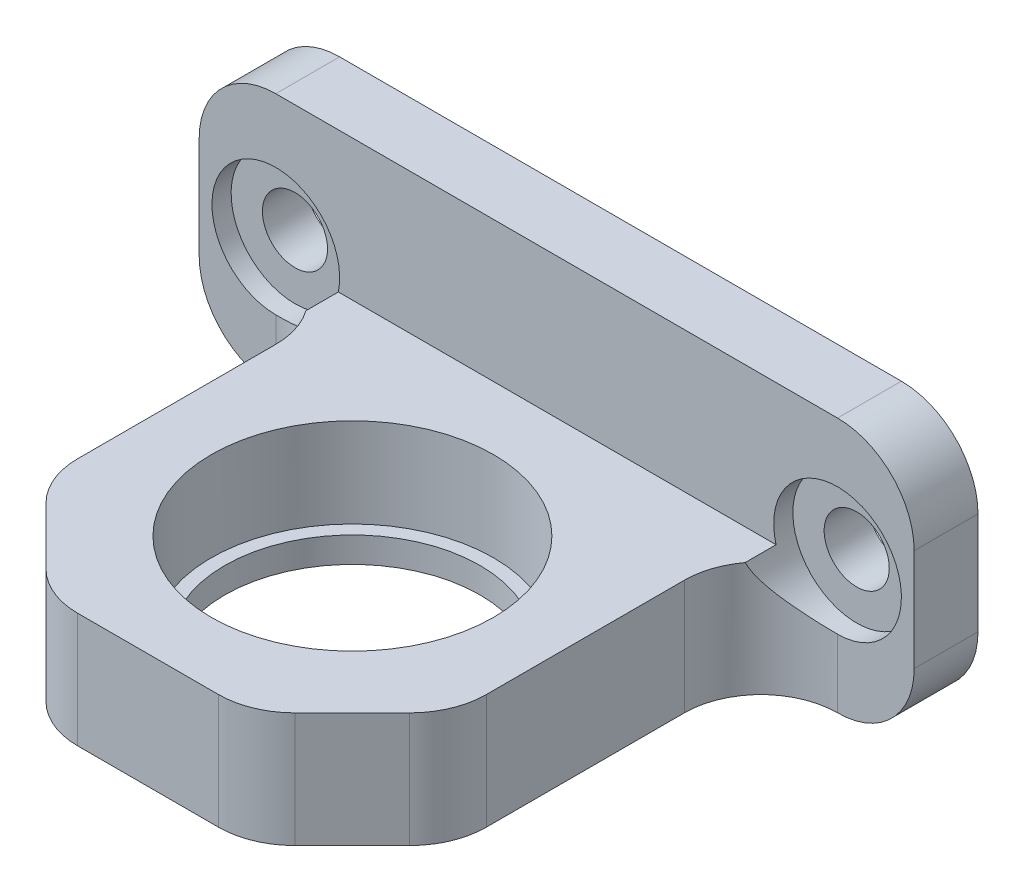
ISO-10303-21;
HEADER;
FILE_DESCRIPTION(('STEP AP214'),'2;1');
FILE_NAME('part.step','',(''),(''),'','','');
FILE_SCHEMA(('AUTOMOTIVE_DESIGN { 1 0 10303 214 1 1 1 1 }'));
ENDSEC;
DATA;
#1=APPLICATION_CONTEXT('core data for automotive mechanical design processes');
#2=APPLICATION_PROTOCOL_DEFINITION('international standard','automotive_design',2000,#1);
#3=PRODUCT_CONTEXT('',#1,'mechanical');
#4=PRODUCT('Part','Part','',(#3));
#5=PRODUCT_RELATED_PRODUCT_CATEGORY('part','',(#4));
#6=PRODUCT_DEFINITION_FORMATION('','',#4);
#7=PRODUCT_DEFINITION_CONTEXT('part definition',#1,'design');
#8=PRODUCT_DEFINITION('design','',#6,#7);
#9=PRODUCT_DEFINITION_SHAPE('','',#8);
#10=(LENGTH_UNIT() NAMED_UNIT(*) SI_UNIT(.MILLI.,.METRE.));
#11=(NAMED_UNIT(*) PLANE_ANGLE_UNIT() SI_UNIT($,.RADIAN.));
#12=(NAMED_UNIT(*) SI_UNIT($,.STERADIAN.) SOLID_ANGLE_UNIT());
#13=UNCERTAINTY_MEASURE_WITH_UNIT(LENGTH_MEASURE(1.E-05),#10,'distance_accuracy_value','');
#14=(GEOMETRIC_REPRESENTATION_CONTEXT(3) GLOBAL_UNCERTAINTY_ASSIGNED_CONTEXT((#13)) GLOBAL_UNIT_ASSIGNED_CONTEXT((#10,
#11,#12)) REPRESENTATION_CONTEXT('',''));
#15=CARTESIAN_POINT('',(0.,0.,0.));
#16=DIRECTION('',(0.,0.,1.));
#17=DIRECTION('',(1.,0.,0.));
#18=AXIS2_PLACEMENT_3D('',#15,#16,#17);
#19=CARTESIAN_POINT('',(22.,10.3404731594054,-21.));
#20=DIRECTION('',(0.,0.,1.));
#21=DIRECTION('',(1.,0.,0.));
#22=AXIS2_PLACEMENT_3D('',#19,#20,#21);
#23=CYLINDRICAL_SURFACE('',#22,2.55);
#24=CARTESIAN_POINT('',(22.,10.3404731594054,-21.));
#25=DIRECTION('',(0.,0.,1.));
#26=DIRECTION('',(1.,0.,0.));
#27=AXIS2_PLACEMENT_3D('',#24,#25,#26);
#28=CIRCLE('',#27,2.55);
#29=CARTESIAN_POINT('',(24.55,10.3404731594054,-21.));
#30=VERTEX_POINT('',#29);
#31=EDGE_CURVE('E446',#30,#30,#28,.T.);
#32=ORIENTED_EDGE('',*,*,#31,.F.);
#33=EDGE_LOOP('',(#32));
#34=FACE_BOUND('',#33,.T.);
#35=CARTESIAN_POINT('',(22.,10.3404731594054,-17.5));
#36=DIRECTION('',(0.,0.,1.));
#37=DIRECTION('',(1.,0.,0.));
#38=AXIS2_PLACEMENT_3D('',#35,#36,#37);
#39=CIRCLE('',#38,2.55);
#40=CARTESIAN_POINT('',(24.55,10.3404731594054,-17.5));
#41=VERTEX_POINT('',#40);
#42=EDGE_CURVE('E439',#41,#41,#39,.F.);
#43=ORIENTED_EDGE('',*,*,#42,.F.);
#44=EDGE_LOOP('',(#43));
#45=FACE_BOUND('',#44,.T.);
#46=ADVANCED_FACE('F33',(#34,#45),#23,.F.);
#47=CARTESIAN_POINT('',(-22.,10.,-21.));
#48=DIRECTION('',(0.,0.,1.));
#49=DIRECTION('',(1.,0.,0.));
#50=AXIS2_PLACEMENT_3D('',#47,#48,#49);
#51=CYLINDRICAL_SURFACE('',#50,2.55);
#52=CARTESIAN_POINT('',(-22.,10.,-21.));
#53=DIRECTION('',(0.,0.,1.));
#54=DIRECTION('',(1.,0.,0.));
#55=AXIS2_PLACEMENT_3D('',#52,#53,#54);
#56=CIRCLE('',#55,2.55);
#57=CARTESIAN_POINT('',(-19.45,10.,-21.));
#58=VERTEX_POINT('',#57);
#59=EDGE_CURVE('E451',#58,#58,#56,.T.);
#60=ORIENTED_EDGE('',*,*,#59,.F.);
#61=EDGE_LOOP('',(#60));
#62=FACE_BOUND('',#61,.T.);
#63=CARTESIAN_POINT('',(-22.,10.,-17.5));
#64=DIRECTION('',(0.,0.,1.));
#65=DIRECTION('',(1.,0.,0.));
#66=AXIS2_PLACEMENT_3D('',#63,#64,#65);
#67=CIRCLE('',#66,2.55);
#68=CARTESIAN_POINT('',(-19.45,10.,-17.5));
#69=VERTEX_POINT('',#68);
#70=EDGE_CURVE('E436',#69,#69,#67,.F.);
#71=ORIENTED_EDGE('',*,*,#70,.F.);
#72=EDGE_LOOP('',(#71));
#73=FACE_BOUND('',#72,.T.);
#74=ADVANCED_FACE('F304',(#62,#73),#51,.F.);
#75=CARTESIAN_POINT('',(0.,9.,0.));
#76=DIRECTION('',(0.,-1.,0.));
#77=DIRECTION('',(0.,0.,-1.));
#78=AXIS2_PLACEMENT_3D('',#75,#76,#77);
#79=PLANE('',#78);
#80=CARTESIAN_POINT('',(0.,9.,0.));
#81=DIRECTION('',(0.,1.,0.));
#82=DIRECTION('',(0.,0.,1.));
#83=AXIS2_PLACEMENT_3D('',#80,#81,#82);
#84=CIRCLE('',#83,11.05);
#85=CARTESIAN_POINT('',(0.,9.,11.05));
#86=VERTEX_POINT('',#85);
#87=EDGE_CURVE('E399',#86,#86,#84,.T.);
#88=ORIENTED_EDGE('',*,*,#87,.F.);
#89=EDGE_LOOP('',(#88));
#90=FACE_BOUND('',#89,.T.);
#91=DIRECTION('',(-0.707106781186549,0.,0.707106781186546));
#92=VECTOR('',#91,1.);
#93=CARTESIAN_POINT('',(16.,9.,8.));
#94=LINE('',#93,#92);
#95=CARTESIAN_POINT('',(9.75735931288069,9.,14.2426406871193));
#96=VERTEX_POINT('',#95);
#97=CARTESIAN_POINT('',(14.2426406871193,9.,9.75735931288072));
#98=VERTEX_POINT('',#97);
#99=EDGE_CURVE('E183',#96,#98,#94,.F.);
#100=ORIENTED_EDGE('',*,*,#99,.T.);
#101=CARTESIAN_POINT('',(10.,9.,5.51471862576143));
#102=DIRECTION('',(0.,-1.,0.));
#103=DIRECTION('',(0.,0.,-1.));
#104=AXIS2_PLACEMENT_3D('',#101,#102,#103);
#105=CIRCLE('',#104,6.);
#106=CARTESIAN_POINT('',(16.,9.,5.51471862576143));
#107=VERTEX_POINT('',#106);
#108=EDGE_CURVE('E178',#98,#107,#105,.F.);
#109=ORIENTED_EDGE('',*,*,#108,.T.);
#110=DIRECTION('',(0.,0.,-1.));
#111=VECTOR('',#110,1.);
#112=CARTESIAN_POINT('',(16.,9.,-16.));
#113=LINE('',#112,#111);
#114=CARTESIAN_POINT('',(16.,9.,-10.));
#115=VERTEX_POINT('',#114);
#116=EDGE_CURVE('E181',#107,#115,#113,.T.);
#117=ORIENTED_EDGE('',*,*,#116,.T.);
#118=CARTESIAN_POINT('',(22.,9.,-10.));
#119=DIRECTION('',(0.,-1.,0.));
#120=DIRECTION('',(0.,0.,-1.));
#121=AXIS2_PLACEMENT_3D('',#118,#119,#120);
#122=CIRCLE('',#121,6.);
#123=CARTESIAN_POINT('',(17.1830370866163,9.,-13.5772710675997));
#124=VERTEX_POINT('',#123);
#125=EDGE_CURVE('E55',#115,#124,#122,.T.);
#126=ORIENTED_EDGE('',*,*,#125,.T.);
#127=DIRECTION('',(0.,0.,-1.));
#128=VECTOR('',#127,1.);
#129=CARTESIAN_POINT('',(17.1830370866163,9.,-16.));
#130=LINE('',#129,#128);
#131=CARTESIAN_POINT('',(17.1830370866163,9.,-16.));
#132=VERTEX_POINT('',#131);
#133=EDGE_CURVE('E37',#132,#124,#130,.F.);
#134=ORIENTED_EDGE('',*,*,#133,.F.);
#135=DIRECTION('',(1.,0.,0.));
#136=VECTOR('',#135,1.);
#137=CARTESIAN_POINT('',(-28.,9.,-16.));
#138=LINE('',#137,#136);
#139=CARTESIAN_POINT('',(-17.1010205144336,9.,-16.));
#140=VERTEX_POINT('',#139);
#141=EDGE_CURVE('E207',#140,#132,#138,.T.);
#142=ORIENTED_EDGE('',*,*,#141,.F.);
#143=DIRECTION('',(0.,0.,-1.));
#144=VECTOR('',#143,1.);
#145=CARTESIAN_POINT('',(-17.1010205144336,9.,-13.4641016151377));
#146=LINE('',#145,#144);
#147=CARTESIAN_POINT('',(-17.1010205144336,9.,-13.4641016151377));
#148=VERTEX_POINT('',#147);
#149=EDGE_CURVE('E11',#140,#148,#146,.F.);
#150=ORIENTED_EDGE('',*,*,#149,.T.);
#151=CARTESIAN_POINT('',(-22.,9.,-9.99999999999999));
#152=DIRECTION('',(0.,-1.,0.));
#153=DIRECTION('',(0.,0.,-1.));
#154=AXIS2_PLACEMENT_3D('',#151,#152,#153);
#155=CIRCLE('',#154,6.);
#156=CARTESIAN_POINT('',(-16.,9.,-9.99999999999999));
#157=VERTEX_POINT('',#156);
#158=EDGE_CURVE('E289',#148,#157,#155,.T.);
#159=ORIENTED_EDGE('',*,*,#158,.T.);
#160=DIRECTION('',(0.,0.,1.));
#161=VECTOR('',#160,1.);
#162=CARTESIAN_POINT('',(-16.,9.,16.));
#163=LINE('',#162,#161);
#164=CARTESIAN_POINT('',(-16.,9.,5.51471862576141));
#165=VERTEX_POINT('',#164);
#166=EDGE_CURVE('E413',#157,#165,#163,.T.);
#167=ORIENTED_EDGE('',*,*,#166,.T.);
#168=CARTESIAN_POINT('',(-10.,9.,5.51471862576141));
#169=DIRECTION('',(0.,-1.,0.));
#170=DIRECTION('',(0.,0.,-1.));
#171=AXIS2_PLACEMENT_3D('',#168,#169,#170);
#172=CIRCLE('',#171,6.);
#173=CARTESIAN_POINT('',(-14.2426406871193,9.,9.75735931288069));
#174=VERTEX_POINT('',#173);
#175=EDGE_CURVE('E224',#165,#174,#172,.F.);
#176=ORIENTED_EDGE('',*,*,#175,.T.);
#177=DIRECTION('',(-0.707106781186546,0.,-0.707106781186549));
#178=VECTOR('',#177,1.);
#179=CARTESIAN_POINT('',(-8.,9.,16.));
#180=LINE('',#179,#178);
#181=CARTESIAN_POINT('',(-9.75735931288071,9.,14.2426406871193));
#182=VERTEX_POINT('',#181);
#183=EDGE_CURVE('E429',#174,#182,#180,.F.);
#184=ORIENTED_EDGE('',*,*,#183,.T.);
#185=CARTESIAN_POINT('',(-5.51471862576142,9.,10.));
#186=DIRECTION('',(0.,-1.,0.));
#187=DIRECTION('',(0.,0.,-1.));
#188=AXIS2_PLACEMENT_3D('',#185,#186,#187);
#189=CIRCLE('',#188,6.);
#190=CARTESIAN_POINT('',(-5.51471862576142,9.,16.));
#191=VERTEX_POINT('',#190);
#192=EDGE_CURVE('E226',#182,#191,#189,.F.);
#193=ORIENTED_EDGE('',*,*,#192,.T.);
#194=DIRECTION('',(1.,0.,0.));
#195=VECTOR('',#194,1.);
#196=CARTESIAN_POINT('',(16.,9.,16.));
#197=LINE('',#196,#195);
#198=CARTESIAN_POINT('',(5.51471862576142,9.,16.));
#199=VERTEX_POINT('',#198);
#200=EDGE_CURVE('E199',#191,#199,#197,.T.);
#201=ORIENTED_EDGE('',*,*,#200,.T.);
#202=CARTESIAN_POINT('',(5.51471862576142,9.,10.));
#203=DIRECTION('',(0.,-1.,0.));
#204=DIRECTION('',(0.,0.,-1.));
#205=AXIS2_PLACEMENT_3D('',#202,#203,#204);
#206=CIRCLE('',#205,6.);
#207=EDGE_CURVE('E188',#199,#96,#206,.F.);
#208=ORIENTED_EDGE('',*,*,#207,.T.);
#209=EDGE_LOOP('',(#100,#109,#117,#126,#134,#142,#150,#159,#167,#176,#184,#193,#201,#208));
#210=FACE_BOUND('',#209,.T.);
#211=ADVANCED_FACE('F180',(#90,#210),#79,.F.);
#212=CARTESIAN_POINT('',(0.,9.,0.));
#213=DIRECTION('',(0.,-1.,0.));
#214=DIRECTION('',(0.,0.,-1.));
#215=AXIS2_PLACEMENT_3D('',#212,#213,#214);
#216=CYLINDRICAL_SURFACE('',#215,11.05);
#217=ORIENTED_EDGE('',*,*,#87,.T.);
#218=EDGE_LOOP('',(#217));
#219=FACE_BOUND('',#218,.T.);
#220=CARTESIAN_POINT('',(0.,2.,0.));
#221=DIRECTION('',(0.,-1.,0.));
#222=DIRECTION('',(0.,0.,-1.));
#223=AXIS2_PLACEMENT_3D('',#220,#221,#222);
#224=CIRCLE('',#223,11.05);
#225=CARTESIAN_POINT('',(0.,2.,-11.05));
#226=VERTEX_POINT('',#225);
#227=EDGE_CURVE('E405',#226,#226,#224,.T.);
#228=ORIENTED_EDGE('',*,*,#227,.T.);
#229=EDGE_LOOP('',(#228));
#230=FACE_BOUND('',#229,.T.);
#231=ADVANCED_FACE('F323',(#219,#230),#216,.F.);
#232=CARTESIAN_POINT('',(0.,0.,0.));
#233=DIRECTION('',(0.,-1.,0.));
#234=DIRECTION('',(0.,0.,-1.));
#235=AXIS2_PLACEMENT_3D('',#232,#233,#234);
#236=PLANE('',#235);
#237=DIRECTION('',(0.,0.,-1.));
#238=VECTOR('',#237,1.);
#239=CARTESIAN_POINT('',(16.,0.,-16.));
#240=LINE('',#239,#238);
#241=CARTESIAN_POINT('',(16.,0.,5.51471862576143));
#242=VERTEX_POINT('',#241);
#243=CARTESIAN_POINT('',(16.,0.,-10.));
#244=VERTEX_POINT('',#243);
#245=EDGE_CURVE('E402',#242,#244,#240,.T.);
#246=ORIENTED_EDGE('',*,*,#245,.F.);
#247=CARTESIAN_POINT('',(10.,0.,5.51471862576143));
#248=DIRECTION('',(0.,-1.,0.));
#249=DIRECTION('',(0.,0.,-1.));
#250=AXIS2_PLACEMENT_3D('',#247,#248,#249);
#251=CIRCLE('',#250,6.);
#252=CARTESIAN_POINT('',(14.2426406871193,0.,9.75735931288072));
#253=VERTEX_POINT('',#252);
#254=EDGE_CURVE('E202',#242,#253,#251,.T.);
#255=ORIENTED_EDGE('',*,*,#254,.T.);
#256=DIRECTION('',(0.707106781186549,0.,-0.707106781186546));
#257=VECTOR('',#256,1.);
#258=CARTESIAN_POINT('',(12.,0.,12.));
#259=LINE('',#258,#257);
#260=CARTESIAN_POINT('',(9.7573593128807,0.,14.2426406871193));
#261=VERTEX_POINT('',#260);
#262=EDGE_CURVE('E426',#253,#261,#259,.F.);
#263=ORIENTED_EDGE('',*,*,#262,.T.);
#264=CARTESIAN_POINT('',(5.51471862576142,0.,10.));
#265=DIRECTION('',(0.,-1.,0.));
#266=DIRECTION('',(0.,0.,-1.));
#267=AXIS2_PLACEMENT_3D('',#264,#265,#266);
#268=CIRCLE('',#267,6.);
#269=CARTESIAN_POINT('',(5.51471862576142,0.,16.));
#270=VERTEX_POINT('',#269);
#271=EDGE_CURVE('E217',#261,#270,#268,.T.);
#272=ORIENTED_EDGE('',*,*,#271,.T.);
#273=DIRECTION('',(1.,0.,0.));
#274=VECTOR('',#273,1.);
#275=CARTESIAN_POINT('',(16.,0.,16.));
#276=LINE('',#275,#274);
#277=CARTESIAN_POINT('',(-5.51471862576142,0.,16.));
#278=VERTEX_POINT('',#277);
#279=EDGE_CURVE('E398',#278,#270,#276,.T.);
#280=ORIENTED_EDGE('',*,*,#279,.F.);
#281=CARTESIAN_POINT('',(-5.51471862576142,0.,10.));
#282=DIRECTION('',(0.,-1.,0.));
#283=DIRECTION('',(0.,0.,-1.));
#284=AXIS2_PLACEMENT_3D('',#281,#282,#283);
#285=CIRCLE('',#284,6.);
#286=CARTESIAN_POINT('',(-9.75735931288071,0.,14.2426406871193));
#287=VERTEX_POINT('',#286);
#288=EDGE_CURVE('E215',#278,#287,#285,.T.);
#289=ORIENTED_EDGE('',*,*,#288,.T.);
#290=DIRECTION('',(0.707106781186546,0.,0.707106781186549));
#291=VECTOR('',#290,1.);
#292=CARTESIAN_POINT('',(-12.,0.,12.));
#293=LINE('',#292,#291);
#294=CARTESIAN_POINT('',(-14.2426406871193,0.,9.75735931288069));
#295=VERTEX_POINT('',#294);
#296=EDGE_CURVE('E394',#287,#295,#293,.F.);
#297=ORIENTED_EDGE('',*,*,#296,.T.);
#298=CARTESIAN_POINT('',(-10.,0.,5.51471862576141));
#299=DIRECTION('',(0.,-1.,0.));
#300=DIRECTION('',(0.,0.,-1.));
#301=AXIS2_PLACEMENT_3D('',#298,#299,#300);
#302=CIRCLE('',#301,6.);
#303=CARTESIAN_POINT('',(-16.,0.,5.51471862576141));
#304=VERTEX_POINT('',#303);
#305=EDGE_CURVE('E213',#295,#304,#302,.T.);
#306=ORIENTED_EDGE('',*,*,#305,.T.);
#307=DIRECTION('',(0.,0.,1.));
#308=VECTOR('',#307,1.);
#309=CARTESIAN_POINT('',(-16.,0.,16.));
#310=LINE('',#309,#308);
#311=CARTESIAN_POINT('',(-16.,0.,-9.99999999999999));
#312=VERTEX_POINT('',#311);
#313=EDGE_CURVE('E392',#312,#304,#310,.T.);
#314=ORIENTED_EDGE('',*,*,#313,.F.);
#315=CARTESIAN_POINT('',(-22.,0.,-9.99999999999999));
#316=DIRECTION('',(0.,-1.,0.));
#317=DIRECTION('',(0.,0.,-1.));
#318=AXIS2_PLACEMENT_3D('',#315,#316,#317);
#319=CIRCLE('',#318,6.);
#320=CARTESIAN_POINT('',(-22.,0.,-16.));
#321=VERTEX_POINT('',#320);
#322=EDGE_CURVE('E281',#312,#321,#319,.F.);
#323=ORIENTED_EDGE('',*,*,#322,.T.);
#324=DIRECTION('',(0.,0.,1.));
#325=VECTOR('',#324,1.);
#326=CARTESIAN_POINT('',(-22.,0.,-21.));
#327=LINE('',#326,#325);
#328=CARTESIAN_POINT('',(-22.,0.,-21.));
#329=VERTEX_POINT('',#328);
#330=EDGE_CURVE('E203',#321,#329,#327,.F.);
#331=ORIENTED_EDGE('',*,*,#330,.T.);
#332=DIRECTION('',(-1.,0.,0.));
#333=VECTOR('',#332,1.);
#334=CARTESIAN_POINT('',(-28.,0.,-21.));
#335=LINE('',#334,#333);
#336=CARTESIAN_POINT('',(22.,0.,-21.));
#337=VERTEX_POINT('',#336);
#338=EDGE_CURVE('E410',#337,#329,#335,.T.);
#339=ORIENTED_EDGE('',*,*,#338,.F.);
#340=DIRECTION('',(0.,0.,-1.));
#341=VECTOR('',#340,1.);
#342=CARTESIAN_POINT('',(22.,0.,-16.));
#343=LINE('',#342,#341);
#344=CARTESIAN_POINT('',(22.,0.,-16.));
#345=VERTEX_POINT('',#344);
#346=EDGE_CURVE('E205',#337,#345,#343,.F.);
#347=ORIENTED_EDGE('',*,*,#346,.T.);
#348=CARTESIAN_POINT('',(22.,0.,-10.));
#349=DIRECTION('',(0.,-1.,0.));
#350=DIRECTION('',(0.,0.,-1.));
#351=AXIS2_PLACEMENT_3D('',#348,#349,#350);
#352=CIRCLE('',#351,6.);
#353=EDGE_CURVE('E513',#345,#244,#352,.F.);
#354=ORIENTED_EDGE('',*,*,#353,.T.);
#355=EDGE_LOOP('',(#246,#255,#263,#272,#280,#289,#297,#306,#314,#323,#331,#339,#347,#354));
#356=FACE_BOUND('',#355,.T.);
#357=CARTESIAN_POINT('',(0.,0.,0.));
#358=DIRECTION('',(0.,-1.,0.));
#359=DIRECTION('',(0.,0.,-1.));
#360=AXIS2_PLACEMENT_3D('',#357,#358,#359);
#361=CIRCLE('',#360,10.);
#362=CARTESIAN_POINT('',(0.,0.,-10.));
#363=VERTEX_POINT('',#362);
#364=EDGE_CURVE('E463',#363,#363,#361,.T.);
#365=ORIENTED_EDGE('',*,*,#364,.F.);
#366=EDGE_LOOP('',(#365));
#367=FACE_BOUND('',#366,.T.);
#368=ADVANCED_FACE('F326',(#356,#367),#236,.T.);
#369=CARTESIAN_POINT('',(-28.,9.,-16.));
#370=DIRECTION('',(1.,0.,0.));
#371=DIRECTION('',(0.,0.,-1.));
#372=AXIS2_PLACEMENT_3D('',#369,#370,#371);
#373=PLANE('',#372);
#374=DIRECTION('',(0.,-1.,0.));
#375=VECTOR('',#374,1.);
#376=CARTESIAN_POINT('',(-28.,9.,-16.));
#377=LINE('',#376,#375);
#378=CARTESIAN_POINT('',(-28.,14.,-16.));
#379=VERTEX_POINT('',#378);
#380=CARTESIAN_POINT('',(-28.,6.,-16.));
#381=VERTEX_POINT('',#380);
#382=EDGE_CURVE('E422',#379,#381,#377,.T.);
#383=ORIENTED_EDGE('',*,*,#382,.F.);
#384=DIRECTION('',(0.,0.,1.));
#385=VECTOR('',#384,1.);
#386=CARTESIAN_POINT('',(-28.,14.,-21.));
#387=LINE('',#386,#385);
#388=CARTESIAN_POINT('',(-28.,14.,-21.));
#389=VERTEX_POINT('',#388);
#390=EDGE_CURVE('E279',#379,#389,#387,.F.);
#391=ORIENTED_EDGE('',*,*,#390,.T.);
#392=DIRECTION('',(0.,-1.,0.));
#393=VECTOR('',#392,1.);
#394=CARTESIAN_POINT('',(-28.,9.,-21.));
#395=LINE('',#394,#393);
#396=CARTESIAN_POINT('',(-28.,6.,-21.));
#397=VERTEX_POINT('',#396);
#398=EDGE_CURVE('E198',#389,#397,#395,.T.);
#399=ORIENTED_EDGE('',*,*,#398,.T.);
#400=DIRECTION('',(0.,0.,1.));
#401=VECTOR('',#400,1.);
#402=CARTESIAN_POINT('',(-28.,6.,-16.));
#403=LINE('',#402,#401);
#404=EDGE_CURVE('E276',#397,#381,#403,.T.);
#405=ORIENTED_EDGE('',*,*,#404,.T.);
#406=EDGE_LOOP('',(#383,#391,#399,#405));
#407=FACE_BOUND('',#406,.T.);
#408=ADVANCED_FACE('F333',(#407),#373,.F.);
#409=CARTESIAN_POINT('',(-16.,9.,16.));
#410=DIRECTION('',(1.,0.,0.));
#411=DIRECTION('',(0.,0.,-1.));
#412=AXIS2_PLACEMENT_3D('',#409,#410,#411);
#413=PLANE('',#412);
#414=ORIENTED_EDGE('',*,*,#313,.T.);
#415=DIRECTION('',(0.,-1.,0.));
#416=VECTOR('',#415,1.);
#417=CARTESIAN_POINT('',(-16.,9.,5.51471862576141));
#418=LINE('',#417,#416);
#419=EDGE_CURVE('E241',#304,#165,#418,.F.);
#420=ORIENTED_EDGE('',*,*,#419,.T.);
#421=ORIENTED_EDGE('',*,*,#166,.F.);
#422=DIRECTION('',(0.,-1.,0.));
#423=VECTOR('',#422,1.);
#424=CARTESIAN_POINT('',(-16.,0.,-9.99999999999999));
#425=LINE('',#424,#423);
#426=EDGE_CURVE('E238',#157,#312,#425,.T.);
#427=ORIENTED_EDGE('',*,*,#426,.T.);
#428=EDGE_LOOP('',(#414,#420,#421,#427));
#429=FACE_BOUND('',#428,.T.);
#430=ADVANCED_FACE('F353',(#429),#413,.F.);
#431=CARTESIAN_POINT('',(16.,9.,16.));
#432=DIRECTION('',(0.,0.,-1.));
#433=DIRECTION('',(-1.,0.,0.));
#434=AXIS2_PLACEMENT_3D('',#431,#432,#433);
#435=PLANE('',#434);
#436=ORIENTED_EDGE('',*,*,#279,.T.);
#437=DIRECTION('',(0.,-1.,0.));
#438=VECTOR('',#437,1.);
#439=CARTESIAN_POINT('',(5.51471862576142,9.,16.));
#440=LINE('',#439,#438);
#441=EDGE_CURVE('E231',#270,#199,#440,.F.);
#442=ORIENTED_EDGE('',*,*,#441,.T.);
#443=ORIENTED_EDGE('',*,*,#200,.F.);
#444=DIRECTION('',(0.,1.,0.));
#445=VECTOR('',#444,1.);
#446=CARTESIAN_POINT('',(-5.51471862576142,0.,16.));
#447=LINE('',#446,#445);
#448=EDGE_CURVE('E187',#191,#278,#447,.F.);
#449=ORIENTED_EDGE('',*,*,#448,.T.);
#450=EDGE_LOOP('',(#436,#442,#443,#449));
#451=FACE_BOUND('',#450,.T.);
#452=ADVANCED_FACE('F350',(#451),#435,.F.);
#453=CARTESIAN_POINT('',(16.,9.,-16.));
#454=DIRECTION('',(-1.,0.,0.));
#455=DIRECTION('',(0.,0.,1.));
#456=AXIS2_PLACEMENT_3D('',#453,#454,#455);
#457=PLANE('',#456);
#458=ORIENTED_EDGE('',*,*,#116,.F.);
#459=DIRECTION('',(0.,1.,0.));
#460=VECTOR('',#459,1.);
#461=CARTESIAN_POINT('',(16.,0.,5.51471862576143));
#462=LINE('',#461,#460);
#463=EDGE_CURVE('E194',#107,#242,#462,.F.);
#464=ORIENTED_EDGE('',*,*,#463,.T.);
#465=ORIENTED_EDGE('',*,*,#245,.T.);
#466=DIRECTION('',(0.,-1.,0.));
#467=VECTOR('',#466,1.);
#468=CARTESIAN_POINT('',(16.,9.,-10.));
#469=LINE('',#468,#467);
#470=EDGE_CURVE('E197',#244,#115,#469,.F.);
#471=ORIENTED_EDGE('',*,*,#470,.T.);
#472=EDGE_LOOP('',(#458,#464,#465,#471));
#473=FACE_BOUND('',#472,.T.);
#474=ADVANCED_FACE('F192',(#473),#457,.F.);
#475=CARTESIAN_POINT('',(28.,9.,-16.));
#476=DIRECTION('',(0.,0.,-1.));
#477=DIRECTION('',(-1.,0.,0.));
#478=AXIS2_PLACEMENT_3D('',#475,#476,#477);
#479=PLANE('',#478);
#480=CARTESIAN_POINT('',(-22.,10.,-16.));
#481=DIRECTION('',(0.,0.,-1.));
#482=DIRECTION('',(-1.,0.,0.));
#483=AXIS2_PLACEMENT_3D('',#480,#481,#482);
#484=CIRCLE('',#483,5.);
#485=CARTESIAN_POINT('',(-22.,5.,-16.));
#486=VERTEX_POINT('',#485);
#487=EDGE_CURVE('E443',#140,#486,#484,.F.);
#488=ORIENTED_EDGE('',*,*,#487,.F.);
#489=ORIENTED_EDGE('',*,*,#141,.T.);
#490=CARTESIAN_POINT('',(22.,10.3404731594054,-16.));
#491=DIRECTION('',(0.,0.,-1.));
#492=DIRECTION('',(-1.,0.,0.));
#493=AXIS2_PLACEMENT_3D('',#490,#491,#492);
#494=CIRCLE('',#493,5.);
#495=CARTESIAN_POINT('',(22.,5.34047315940536,-16.));
#496=VERTEX_POINT('',#495);
#497=EDGE_CURVE('E444',#496,#132,#494,.F.);
#498=ORIENTED_EDGE('',*,*,#497,.F.);
#499=DIRECTION('',(0.,-1.,0.));
#500=VECTOR('',#499,1.);
#501=CARTESIAN_POINT('',(22.,0.,-16.));
#502=LINE('',#501,#500);
#503=EDGE_CURVE('E255',#496,#345,#502,.T.);
#504=ORIENTED_EDGE('',*,*,#503,.T.);
#505=CARTESIAN_POINT('',(22.,6.,-16.));
#506=DIRECTION('',(0.,0.,-1.));
#507=DIRECTION('',(-1.,0.,0.));
#508=AXIS2_PLACEMENT_3D('',#505,#506,#507);
#509=CIRCLE('',#508,6.);
#510=CARTESIAN_POINT('',(28.,6.,-16.));
#511=VERTEX_POINT('',#510);
#512=EDGE_CURVE('E253',#345,#511,#509,.F.);
#513=ORIENTED_EDGE('',*,*,#512,.T.);
#514=DIRECTION('',(0.,-1.,0.));
#515=VECTOR('',#514,1.);
#516=CARTESIAN_POINT('',(28.,9.,-16.));
#517=LINE('',#516,#515);
#518=CARTESIAN_POINT('',(28.,14.,-16.));
#519=VERTEX_POINT('',#518);
#520=EDGE_CURVE('E419',#519,#511,#517,.T.);
#521=ORIENTED_EDGE('',*,*,#520,.F.);
#522=CARTESIAN_POINT('',(22.,14.,-16.));
#523=DIRECTION('',(0.,0.,-1.));
#524=DIRECTION('',(-1.,0.,0.));
#525=AXIS2_PLACEMENT_3D('',#522,#523,#524);
#526=CIRCLE('',#525,6.);
#527=CARTESIAN_POINT('',(22.,20.,-16.));
#528=VERTEX_POINT('',#527);
#529=EDGE_CURVE('E251',#519,#528,#526,.F.);
#530=ORIENTED_EDGE('',*,*,#529,.T.);
#531=DIRECTION('',(-1.,0.,0.));
#532=VECTOR('',#531,1.);
#533=CARTESIAN_POINT('',(-28.,20.,-16.));
#534=LINE('',#533,#532);
#535=CARTESIAN_POINT('',(-22.,20.,-16.));
#536=VERTEX_POINT('',#535);
#537=EDGE_CURVE('E456',#528,#536,#534,.T.);
#538=ORIENTED_EDGE('',*,*,#537,.T.);
#539=CARTESIAN_POINT('',(-22.,14.,-16.));
#540=DIRECTION('',(0.,0.,-1.));
#541=DIRECTION('',(-1.,0.,0.));
#542=AXIS2_PLACEMENT_3D('',#539,#540,#541);
#543=CIRCLE('',#542,6.);
#544=EDGE_CURVE('E249',#536,#379,#543,.F.);
#545=ORIENTED_EDGE('',*,*,#544,.T.);
#546=ORIENTED_EDGE('',*,*,#382,.T.);
#547=CARTESIAN_POINT('',(-22.,6.,-16.));
#548=DIRECTION('',(0.,0.,-1.));
#549=DIRECTION('',(-1.,0.,0.));
#550=AXIS2_PLACEMENT_3D('',#547,#548,#549);
#551=CIRCLE('',#550,6.);
#552=EDGE_CURVE('E244',#381,#321,#551,.F.);
#553=ORIENTED_EDGE('',*,*,#552,.T.);
#554=DIRECTION('',(0.,-1.,0.));
#555=VECTOR('',#554,1.);
#556=CARTESIAN_POINT('',(-22.,9.,-16.));
#557=LINE('',#556,#555);
#558=EDGE_CURVE('E247',#321,#486,#557,.F.);
#559=ORIENTED_EDGE('',*,*,#558,.T.);
#560=EDGE_LOOP('',(#488,#489,#498,#504,#513,#521,#530,#538,#545,#546,#553,#559));
#561=FACE_BOUND('',#560,.T.);
#562=ADVANCED_FACE('F343',(#561),#479,.F.);
#563=CARTESIAN_POINT('',(28.,9.,-21.));
#564=DIRECTION('',(-1.,0.,0.));
#565=DIRECTION('',(0.,0.,1.));
#566=AXIS2_PLACEMENT_3D('',#563,#564,#565);
#567=PLANE('',#566);
#568=ORIENTED_EDGE('',*,*,#520,.T.);
#569=DIRECTION('',(0.,0.,-1.));
#570=VECTOR('',#569,1.);
#571=CARTESIAN_POINT('',(28.,6.,-21.));
#572=LINE('',#571,#570);
#573=CARTESIAN_POINT('',(28.,6.,-21.));
#574=VERTEX_POINT('',#573);
#575=EDGE_CURVE('E260',#511,#574,#572,.T.);
#576=ORIENTED_EDGE('',*,*,#575,.T.);
#577=DIRECTION('',(0.,-1.,0.));
#578=VECTOR('',#577,1.);
#579=CARTESIAN_POINT('',(28.,9.,-21.));
#580=LINE('',#579,#578);
#581=CARTESIAN_POINT('',(28.,14.,-21.));
#582=VERTEX_POINT('',#581);
#583=EDGE_CURVE('E416',#582,#574,#580,.T.);
#584=ORIENTED_EDGE('',*,*,#583,.F.);
#585=DIRECTION('',(0.,0.,1.));
#586=VECTOR('',#585,1.);
#587=CARTESIAN_POINT('',(28.,14.,-16.));
#588=LINE('',#587,#586);
#589=EDGE_CURVE('E257',#582,#519,#588,.T.);
#590=ORIENTED_EDGE('',*,*,#589,.T.);
#591=EDGE_LOOP('',(#568,#576,#584,#590));
#592=FACE_BOUND('',#591,.T.);
#593=ADVANCED_FACE('F339',(#592),#567,.F.);
#594=CARTESIAN_POINT('',(-28.,9.,-21.));
#595=DIRECTION('',(0.,0.,1.));
#596=DIRECTION('',(1.,0.,0.));
#597=AXIS2_PLACEMENT_3D('',#594,#595,#596);
#598=PLANE('',#597);
#599=ORIENTED_EDGE('',*,*,#59,.T.);
#600=EDGE_LOOP('',(#599));
#601=FACE_BOUND('',#600,.T.);
#602=ORIENTED_EDGE('',*,*,#31,.T.);
#603=EDGE_LOOP('',(#602));
#604=FACE_BOUND('',#603,.T.);
#605=ORIENTED_EDGE('',*,*,#583,.T.);
#606=CARTESIAN_POINT('',(22.,6.,-21.));
#607=DIRECTION('',(0.,0.,1.));
#608=DIRECTION('',(1.,0.,0.));
#609=AXIS2_PLACEMENT_3D('',#606,#607,#608);
#610=CIRCLE('',#609,6.);
#611=EDGE_CURVE('E269',#574,#337,#610,.F.);
#612=ORIENTED_EDGE('',*,*,#611,.T.);
#613=ORIENTED_EDGE('',*,*,#338,.T.);
#614=CARTESIAN_POINT('',(-22.,6.,-21.));
#615=DIRECTION('',(0.,0.,1.));
#616=DIRECTION('',(1.,0.,0.));
#617=AXIS2_PLACEMENT_3D('',#614,#615,#616);
#618=CIRCLE('',#617,6.);
#619=EDGE_CURVE('E263',#329,#397,#618,.F.);
#620=ORIENTED_EDGE('',*,*,#619,.T.);
#621=ORIENTED_EDGE('',*,*,#398,.F.);
#622=CARTESIAN_POINT('',(-22.,14.,-21.));
#623=DIRECTION('',(0.,0.,1.));
#624=DIRECTION('',(1.,0.,0.));
#625=AXIS2_PLACEMENT_3D('',#622,#623,#624);
#626=CIRCLE('',#625,6.);
#627=CARTESIAN_POINT('',(-22.,20.,-21.));
#628=VERTEX_POINT('',#627);
#629=EDGE_CURVE('E265',#389,#628,#626,.F.);
#630=ORIENTED_EDGE('',*,*,#629,.T.);
#631=DIRECTION('',(1.,0.,0.));
#632=VECTOR('',#631,1.);
#633=CARTESIAN_POINT('',(-28.,20.,-21.));
#634=LINE('',#633,#632);
#635=CARTESIAN_POINT('',(22.,20.,-21.));
#636=VERTEX_POINT('',#635);
#637=EDGE_CURVE('E460',#628,#636,#634,.T.);
#638=ORIENTED_EDGE('',*,*,#637,.T.);
#639=CARTESIAN_POINT('',(22.,14.,-21.));
#640=DIRECTION('',(0.,0.,1.));
#641=DIRECTION('',(1.,0.,0.));
#642=AXIS2_PLACEMENT_3D('',#639,#640,#641);
#643=CIRCLE('',#642,6.);
#644=EDGE_CURVE('E267',#636,#582,#643,.F.);
#645=ORIENTED_EDGE('',*,*,#644,.T.);
#646=EDGE_LOOP('',(#605,#612,#613,#620,#621,#630,#638,#645));
#647=FACE_BOUND('',#646,.T.);
#648=ADVANCED_FACE('F335',(#601,#604,#647),#598,.F.);
#649=CARTESIAN_POINT('',(16.,9.,8.));
#650=DIRECTION('',(-0.707106781186546,0.,-0.707106781186548));
#651=DIRECTION('',(0.,-1.,0.));
#652=AXIS2_PLACEMENT_3D('',#649,#650,#651);
#653=PLANE('',#652);
#654=ORIENTED_EDGE('',*,*,#262,.F.);
#655=DIRECTION('',(0.,-1.,0.));
#656=VECTOR('',#655,1.);
#657=CARTESIAN_POINT('',(14.2426406871193,9.,9.75735931288072));
#658=LINE('',#657,#656);
#659=EDGE_CURVE('E222',#253,#98,#658,.F.);
#660=ORIENTED_EDGE('',*,*,#659,.T.);
#661=ORIENTED_EDGE('',*,*,#99,.F.);
#662=DIRECTION('',(0.,1.,0.));
#663=VECTOR('',#662,1.);
#664=CARTESIAN_POINT('',(9.75735931288069,0.,14.2426406871193));
#665=LINE('',#664,#663);
#666=EDGE_CURVE('E220',#96,#261,#665,.F.);
#667=ORIENTED_EDGE('',*,*,#666,.T.);
#668=EDGE_LOOP('',(#654,#660,#661,#667));
#669=FACE_BOUND('',#668,.T.);
#670=ADVANCED_FACE('F338',(#669),#653,.F.);
#671=CARTESIAN_POINT('',(-8.,9.,16.));
#672=DIRECTION('',(0.707106781186549,0.,-0.707106781186546));
#673=DIRECTION('',(0.,-1.,0.));
#674=AXIS2_PLACEMENT_3D('',#671,#672,#673);
#675=PLANE('',#674);
#676=ORIENTED_EDGE('',*,*,#296,.F.);
#677=DIRECTION('',(0.,-1.,0.));
#678=VECTOR('',#677,1.);
#679=CARTESIAN_POINT('',(-9.75735931288071,9.,14.2426406871193));
#680=LINE('',#679,#678);
#681=EDGE_CURVE('E236',#287,#182,#680,.F.);
#682=ORIENTED_EDGE('',*,*,#681,.T.);
#683=ORIENTED_EDGE('',*,*,#183,.F.);
#684=DIRECTION('',(0.,1.,0.));
#685=VECTOR('',#684,1.);
#686=CARTESIAN_POINT('',(-14.2426406871193,0.,9.75735931288069));
#687=LINE('',#686,#685);
#688=EDGE_CURVE('E234',#174,#295,#687,.F.);
#689=ORIENTED_EDGE('',*,*,#688,.T.);
#690=EDGE_LOOP('',(#676,#682,#683,#689));
#691=FACE_BOUND('',#690,.T.);
#692=ADVANCED_FACE('F321',(#691),#675,.F.);
#693=CARTESIAN_POINT('',(0.,2.,0.));
#694=DIRECTION('',(0.,-1.,0.));
#695=DIRECTION('',(0.,0.,-1.));
#696=AXIS2_PLACEMENT_3D('',#693,#694,#695);
#697=PLANE('',#696);
#698=CARTESIAN_POINT('',(0.,2.,0.));
#699=DIRECTION('',(0.,-1.,0.));
#700=DIRECTION('',(0.,0.,-1.));
#701=AXIS2_PLACEMENT_3D('',#698,#699,#700);
#702=CIRCLE('',#701,10.);
#703=CARTESIAN_POINT('',(0.,2.,-10.));
#704=VERTEX_POINT('',#703);
#705=EDGE_CURVE('E435',#704,#704,#702,.T.);
#706=ORIENTED_EDGE('',*,*,#705,.T.);
#707=EDGE_LOOP('',(#706));
#708=FACE_BOUND('',#707,.T.);
#709=ORIENTED_EDGE('',*,*,#227,.F.);
#710=EDGE_LOOP('',(#709));
#711=FACE_BOUND('',#710,.T.);
#712=ADVANCED_FACE('F317',(#708,#711),#697,.F.);
#713=CARTESIAN_POINT('',(0.,2.,0.));
#714=DIRECTION('',(0.,-1.,0.));
#715=DIRECTION('',(0.,0.,-1.));
#716=AXIS2_PLACEMENT_3D('',#713,#714,#715);
#717=CYLINDRICAL_SURFACE('',#716,10.);
#718=ORIENTED_EDGE('',*,*,#705,.F.);
#719=EDGE_LOOP('',(#718));
#720=FACE_BOUND('',#719,.T.);
#721=ORIENTED_EDGE('',*,*,#364,.T.);
#722=EDGE_LOOP('',(#721));
#723=FACE_BOUND('',#722,.T.);
#724=ADVANCED_FACE('F313',(#720,#723),#717,.F.);
#725=CARTESIAN_POINT('',(-28.,20.,-78.0701322935211));
#726=DIRECTION('',(0.,1.,0.));
#727=DIRECTION('',(0.,0.,1.));
#728=AXIS2_PLACEMENT_3D('',#725,#726,#727);
#729=PLANE('',#728);
#730=ORIENTED_EDGE('',*,*,#537,.F.);
#731=DIRECTION('',(0.,0.,1.));
#732=VECTOR('',#731,1.);
#733=CARTESIAN_POINT('',(22.,20.,-21.));
#734=LINE('',#733,#732);
#735=EDGE_CURVE('E274',#528,#636,#734,.F.);
#736=ORIENTED_EDGE('',*,*,#735,.T.);
#737=ORIENTED_EDGE('',*,*,#637,.F.);
#738=DIRECTION('',(0.,0.,1.));
#739=VECTOR('',#738,1.);
#740=CARTESIAN_POINT('',(-22.,20.,-16.));
#741=LINE('',#740,#739);
#742=EDGE_CURVE('E271',#628,#536,#741,.T.);
#743=ORIENTED_EDGE('',*,*,#742,.T.);
#744=EDGE_LOOP('',(#730,#736,#737,#743));
#745=FACE_BOUND('',#744,.T.);
#746=ADVANCED_FACE('F301',(#745),#729,.T.);
#747=CARTESIAN_POINT('',(-22.,10.,-6.));
#748=DIRECTION('',(0.,0.,-1.));
#749=DIRECTION('',(-1.,0.,0.));
#750=AXIS2_PLACEMENT_3D('',#747,#748,#749);
#751=CYLINDRICAL_SURFACE('',#750,5.);
#752=CARTESIAN_POINT('',(-22.,10.,-17.5));
#753=DIRECTION('',(0.,0.,1.));
#754=DIRECTION('',(1.,0.,0.));
#755=AXIS2_PLACEMENT_3D('',#752,#753,#754);
#756=CIRCLE('',#755,5.);
#757=CARTESIAN_POINT('',(-17.,10.,-17.5));
#758=VERTEX_POINT('',#757);
#759=EDGE_CURVE('E729',#758,#758,#756,.T.);
#760=ORIENTED_EDGE('',*,*,#759,.F.);
#761=EDGE_LOOP('',(#760));
#762=FACE_BOUND('',#761,.T.);
#763=ORIENTED_EDGE('',*,*,#487,.T.);
#764=CARTESIAN_POINT('',(-22.,5.,-16.));
#765=CARTESIAN_POINT('',(-21.8806648207195,4.99997202847822,-16.000029183418));
#766=CARTESIAN_POINT('',(-21.7613479343884,5.00427098058813,-15.9964410262926));
#767=CARTESIAN_POINT('',(-21.5238201363629,5.02131096987406,-15.9822490295306));
#768=CARTESIAN_POINT('',(-21.4056085061772,5.03404607051304,-15.9716501233819));
#769=CARTESIAN_POINT('',(-21.1720645381227,5.06762141944364,-15.9437594959527));
#770=CARTESIAN_POINT('',(-21.0567172985143,5.08840048802287,-15.9265182983554));
#771=CARTESIAN_POINT('',(-20.8288244206442,5.13770232719081,-15.8857239180364));
#772=CARTESIAN_POINT('',(-20.7162791417845,5.16622608564603,-15.8621699300977));
#773=CARTESIAN_POINT('',(-20.4950156511032,5.23048680134044,-15.8092962749121));
#774=CARTESIAN_POINT('',(-20.3862877576041,5.26620368734832,-15.7799926567871));
#775=CARTESIAN_POINT('',(-20.1728799032746,5.34440480803738,-15.7161228971515));
#776=CARTESIAN_POINT('',(-20.0682014293066,5.3868914996821,-15.6815548452237));
#777=CARTESIAN_POINT('',(-19.7606711610699,5.52387069151109,-15.5707113290423));
#778=CARTESIAN_POINT('',(-19.5644626306319,5.62784133927979,-15.4873305892445));
#779=CARTESIAN_POINT('',(-19.2512946634051,5.82064767574377,-15.3352306081538));
#780=CARTESIAN_POINT('',(-19.1289070399765,5.90385916725544,-15.2702230161879));
#781=CARTESIAN_POINT('',(-18.8937041616226,6.07923225448275,-15.1351036558362));
#782=CARTESIAN_POINT('',(-18.7808890961821,6.17139402728806,-15.0649917864643));
#783=CARTESIAN_POINT('',(-18.5645823422536,6.36420713404151,-14.9208607028787));
#784=CARTESIAN_POINT('',(-18.4611268613701,6.46488874572616,-14.8468279357524));
#785=CARTESIAN_POINT('',(-18.2640199828492,6.67387874383037,-14.6965735314705));
#786=CARTESIAN_POINT('',(-18.1703674746073,6.78218626396017,-14.6203521435191));
#787=CARTESIAN_POINT('',(-17.9910639299656,7.00839742529323,-14.4657277504505));
#788=CARTESIAN_POINT('',(-17.9056131493249,7.12645089669107,-14.3873118095147));
#789=CARTESIAN_POINT('',(-17.7449686850084,7.37016684309937,-14.2316913984726));
#790=CARTESIAN_POINT('',(-17.6697779980127,7.49583152571933,-14.1544872881091));
#791=CARTESIAN_POINT('',(-17.5304264441487,7.75405276037758,-14.0041644871796));
#792=CARTESIAN_POINT('',(-17.4661915085789,7.88655443922633,-13.9310208179248));
#793=CARTESIAN_POINT('',(-17.3486877755119,8.15951619706664,-13.7912558827877));
#794=CARTESIAN_POINT('',(-17.2954113244464,8.29997063370269,-13.7246300819005));
#795=CARTESIAN_POINT('',(-17.1964134115726,8.60248514328405,-13.59620669379));
#796=CARTESIAN_POINT('',(-17.1518045455888,8.76535180454495,-13.5353844014582));
#797=CARTESIAN_POINT('',(-17.0783099665741,9.10172995105932,-13.4323511227873));
#798=CARTESIAN_POINT('',(-17.0495641482094,9.27532158951348,-13.3903063327462));
#799=CARTESIAN_POINT('',(-17.0300022101679,9.45307955874389,-13.361416661032));
#800=B_SPLINE_CURVE_WITH_KNOTS('',3,(#764,#765,#766,#767,#768,#769,#770,#771,#772,#773,#774,
#775,#776,#777,#778,#779,#780,#781,#782,#783,#784,#785,#786,#787,#788,#789,#790,#791,#792,#793,
#794,#795,#796,#797,#798,#799),.UNSPECIFIED.,.F.,.F.,(4,2,2,2,2,2,2,2,2,2,2,2,2,2,2,2,2,4),(0.,
0.357845344312491,0.715439139161972,1.07036500055284,1.42533615545792,1.77933021380853,
2.13345304097954,2.84213806663911,3.32653214070429,3.81093580091177,4.29713970109727,
4.78328845821013,5.27927441347619,5.77540492340351,6.26803544217961,6.76032072340998,
7.29694347482022,7.83822595793125),.UNSPECIFIED.);
#801=EDGE_CURVE('E48',#486,#148,#800,.T.);
#802=ORIENTED_EDGE('',*,*,#801,.T.);
#803=ORIENTED_EDGE('',*,*,#149,.F.);
#804=EDGE_LOOP('',(#763,#802,#803));
#805=FACE_BOUND('',#804,.T.);
#806=ADVANCED_FACE('F295',(#762,#805),#751,.F.);
#807=CARTESIAN_POINT('',(-22.,10.,-17.5));
#808=DIRECTION('',(0.,0.,1.));
#809=DIRECTION('',(1.,0.,0.));
#810=AXIS2_PLACEMENT_3D('',#807,#808,#809);
#811=PLANE('',#810);
#812=ORIENTED_EDGE('',*,*,#759,.T.);
#813=EDGE_LOOP('',(#812));
#814=FACE_BOUND('',#813,.T.);
#815=ORIENTED_EDGE('',*,*,#70,.T.);
#816=EDGE_LOOP('',(#815));
#817=FACE_BOUND('',#816,.T.);
#818=ADVANCED_FACE('F300',(#814,#817),#811,.T.);
#819=CARTESIAN_POINT('',(22.,10.3404731594054,-6.));
#820=DIRECTION('',(0.,0.,-1.));
#821=DIRECTION('',(-1.,0.,0.));
#822=AXIS2_PLACEMENT_3D('',#819,#820,#821);
#823=CYLINDRICAL_SURFACE('',#822,5.);
#824=CARTESIAN_POINT('',(22.,10.3404731594054,-17.5));
#825=DIRECTION('',(0.,0.,1.));
#826=DIRECTION('',(1.,0.,0.));
#827=AXIS2_PLACEMENT_3D('',#824,#825,#826);
#828=CIRCLE('',#827,5.);
#829=CARTESIAN_POINT('',(27.,10.3404731594054,-17.5));
#830=VERTEX_POINT('',#829);
#831=EDGE_CURVE('E440',#830,#830,#828,.T.);
#832=ORIENTED_EDGE('',*,*,#831,.F.);
#833=EDGE_LOOP('',(#832));
#834=FACE_BOUND('',#833,.T.);
#835=ORIENTED_EDGE('',*,*,#497,.T.);
#836=ORIENTED_EDGE('',*,*,#133,.T.);
#837=CARTESIAN_POINT('',(22.,5.34047315940536,-16.));
#838=CARTESIAN_POINT('',(21.8806648207195,5.34044518788359,-16.000029183418));
#839=CARTESIAN_POINT('',(21.7613479343884,5.3447441399935,-15.9964410262926));
#840=CARTESIAN_POINT('',(21.5238201363629,5.36178412927942,-15.9822490295306));
#841=CARTESIAN_POINT('',(21.4056085061772,5.3745192299184,-15.9716501233819));
#842=CARTESIAN_POINT('',(21.1720645381227,5.408094578849,-15.9437594959527));
#843=CARTESIAN_POINT('',(21.0567172985143,5.42887364742823,-15.9265182983554));
#844=CARTESIAN_POINT('',(20.8288244206442,5.47817548659617,-15.8857239180364));
#845=CARTESIAN_POINT('',(20.7162791417845,5.5066992450514,-15.8621699300977));
#846=CARTESIAN_POINT('',(20.4950156511032,5.5709599607458,-15.8092962749121));
#847=CARTESIAN_POINT('',(20.3862877576041,5.60667684675368,-15.7799926567871));
#848=CARTESIAN_POINT('',(20.1728799032746,5.68487796744274,-15.7161228971515));
#849=CARTESIAN_POINT('',(20.0682014293066,5.72736465908746,-15.6815548452238));
#850=CARTESIAN_POINT('',(19.7606711610699,5.86434385091645,-15.5707113290424));
#851=CARTESIAN_POINT('',(19.5644626306319,5.96831449868515,-15.4873305892445));
#852=CARTESIAN_POINT('',(19.2512946634051,6.16112083514913,-15.3352306081538));
#853=CARTESIAN_POINT('',(19.1289070399765,6.2443323266608,-15.2702230161879));
#854=CARTESIAN_POINT('',(18.8937041616226,6.41970541388811,-15.1351036558362));
#855=CARTESIAN_POINT('',(18.7808890961821,6.51186718669342,-15.0649917864643));
#856=CARTESIAN_POINT('',(18.5645823422536,6.70468029344687,-14.9208607028787));
#857=CARTESIAN_POINT('',(18.4611268613701,6.80536190513152,-14.8468279357524));
#858=CARTESIAN_POINT('',(18.2640199828492,7.01435190323573,-14.6965735314705));
#859=CARTESIAN_POINT('',(18.1703674746073,7.12265942336553,-14.6203521435191));
#860=CARTESIAN_POINT('',(17.9910639299656,7.3488705846986,-14.4657277504505));
#861=CARTESIAN_POINT('',(17.9056131493249,7.46692405609643,-14.3873118095147));
#862=CARTESIAN_POINT('',(17.7449686850084,7.71064000250472,-14.2316913984726));
#863=CARTESIAN_POINT('',(17.6697779980127,7.83630468512469,-14.1544872881091));
#864=CARTESIAN_POINT('',(17.5304264441487,8.09452591978293,-14.0041644871796));
#865=CARTESIAN_POINT('',(17.4661915085789,8.22702759863169,-13.9310208179248));
#866=CARTESIAN_POINT('',(17.3486877755119,8.49998935647199,-13.7912558827877));
#867=CARTESIAN_POINT('',(17.2954113244464,8.64044379310804,-13.7246300819005));
#868=CARTESIAN_POINT('',(17.1964134115726,8.94295830268941,-13.59620669379));
#869=CARTESIAN_POINT('',(17.1518045455888,9.10582496395031,-13.5353844014582));
#870=CARTESIAN_POINT('',(17.0783099665741,9.44220311046468,-13.4323511227873));
#871=CARTESIAN_POINT('',(17.0495641482094,9.61579474891884,-13.3903063327462));
#872=CARTESIAN_POINT('',(17.0300022101679,9.79355271814925,-13.361416661032));
#873=B_SPLINE_CURVE_WITH_KNOTS('',3,(#837,#838,#839,#840,#841,#842,#843,#844,#845,#846,#847,
#848,#849,#850,#851,#852,#853,#854,#855,#856,#857,#858,#859,#860,#861,#862,#863,#864,#865,#866,
#867,#868,#869,#870,#871,#872),.UNSPECIFIED.,.F.,.F.,(4,2,2,2,2,2,2,2,2,2,2,2,2,2,2,2,2,4),(0.,
0.357845344312491,0.715439139161972,1.07036500055284,1.42533615545792,1.77933021380853,
2.13345304097954,2.84213806663911,3.32653214070429,3.81093580091177,4.29713970109727,
4.78328845821013,5.27927441347619,5.77540492340351,6.2680354421796,6.76032072340999,
7.29694347482022,7.83822595793125),.UNSPECIFIED.);
#874=EDGE_CURVE('E512',#124,#496,#873,.F.);
#875=ORIENTED_EDGE('',*,*,#874,.T.);
#876=EDGE_LOOP('',(#835,#836,#875));
#877=FACE_BOUND('',#876,.T.);
#878=ADVANCED_FACE('F514',(#834,#877),#823,.F.);
#879=CARTESIAN_POINT('',(22.,10.3404731594054,-17.5));
#880=DIRECTION('',(0.,0.,1.));
#881=DIRECTION('',(1.,0.,0.));
#882=AXIS2_PLACEMENT_3D('',#879,#880,#881);
#883=PLANE('',#882);
#884=ORIENTED_EDGE('',*,*,#831,.T.);
#885=EDGE_LOOP('',(#884));
#886=FACE_BOUND('',#885,.T.);
#887=ORIENTED_EDGE('',*,*,#42,.T.);
#888=EDGE_LOOP('',(#887));
#889=FACE_BOUND('',#888,.T.);
#890=ADVANCED_FACE('F370',(#886,#889),#883,.T.);
#891=CARTESIAN_POINT('',(10.,9.,5.51471862576143));
#892=DIRECTION('',(0.,-1.,0.));
#893=DIRECTION('',(0.,0.,-1.));
#894=AXIS2_PLACEMENT_3D('',#891,#892,#893);
#895=CYLINDRICAL_SURFACE('',#894,6.);
#896=ORIENTED_EDGE('',*,*,#108,.F.);
#897=ORIENTED_EDGE('',*,*,#659,.F.);
#898=ORIENTED_EDGE('',*,*,#254,.F.);
#899=ORIENTED_EDGE('',*,*,#463,.F.);
#900=EDGE_LOOP('',(#896,#897,#898,#899));
#901=FACE_BOUND('',#900,.T.);
#902=ADVANCED_FACE('F201',(#901),#895,.T.);
#903=CARTESIAN_POINT('',(5.51471862576142,9.,10.));
#904=DIRECTION('',(0.,1.,0.));
#905=DIRECTION('',(0.,0.,1.));
#906=AXIS2_PLACEMENT_3D('',#903,#904,#905);
#907=CYLINDRICAL_SURFACE('',#906,6.);
#908=ORIENTED_EDGE('',*,*,#271,.F.);
#909=ORIENTED_EDGE('',*,*,#666,.F.);
#910=ORIENTED_EDGE('',*,*,#207,.F.);
#911=ORIENTED_EDGE('',*,*,#441,.F.);
#912=EDGE_LOOP('',(#908,#909,#910,#911));
#913=FACE_BOUND('',#912,.T.);
#914=ADVANCED_FACE('F369',(#913),#907,.T.);
#915=CARTESIAN_POINT('',(-5.51471862576142,9.,10.));
#916=DIRECTION('',(0.,-1.,0.));
#917=DIRECTION('',(0.,0.,-1.));
#918=AXIS2_PLACEMENT_3D('',#915,#916,#917);
#919=CYLINDRICAL_SURFACE('',#918,6.);
#920=ORIENTED_EDGE('',*,*,#192,.F.);
#921=ORIENTED_EDGE('',*,*,#681,.F.);
#922=ORIENTED_EDGE('',*,*,#288,.F.);
#923=ORIENTED_EDGE('',*,*,#448,.F.);
#924=EDGE_LOOP('',(#920,#921,#922,#923));
#925=FACE_BOUND('',#924,.T.);
#926=ADVANCED_FACE('F373',(#925),#919,.T.);
#927=CARTESIAN_POINT('',(-10.,9.,5.51471862576141));
#928=DIRECTION('',(0.,1.,0.));
#929=DIRECTION('',(0.,0.,1.));
#930=AXIS2_PLACEMENT_3D('',#927,#928,#929);
#931=CYLINDRICAL_SURFACE('',#930,6.);
#932=ORIENTED_EDGE('',*,*,#305,.F.);
#933=ORIENTED_EDGE('',*,*,#688,.F.);
#934=ORIENTED_EDGE('',*,*,#175,.F.);
#935=ORIENTED_EDGE('',*,*,#419,.F.);
#936=EDGE_LOOP('',(#932,#933,#934,#935));
#937=FACE_BOUND('',#936,.T.);
#938=ADVANCED_FACE('F376',(#937),#931,.T.);
#939=CARTESIAN_POINT('',(-22.,9.,-9.99999999999999));
#940=DIRECTION('',(0.,1.,0.));
#941=DIRECTION('',(0.,0.,1.));
#942=AXIS2_PLACEMENT_3D('',#939,#940,#941);
#943=CYLINDRICAL_SURFACE('',#942,6.);
#944=ORIENTED_EDGE('',*,*,#801,.F.);
#945=ORIENTED_EDGE('',*,*,#558,.F.);
#946=ORIENTED_EDGE('',*,*,#322,.F.);
#947=ORIENTED_EDGE('',*,*,#426,.F.);
#948=ORIENTED_EDGE('',*,*,#158,.F.);
#949=EDGE_LOOP('',(#944,#945,#946,#947,#948));
#950=FACE_BOUND('',#949,.T.);
#951=ADVANCED_FACE('F291',(#950),#943,.F.);
#952=CARTESIAN_POINT('',(22.,9.,-10.));
#953=DIRECTION('',(0.,1.,0.));
#954=DIRECTION('',(0.,0.,1.));
#955=AXIS2_PLACEMENT_3D('',#952,#953,#954);
#956=CYLINDRICAL_SURFACE('',#955,6.);
#957=ORIENTED_EDGE('',*,*,#125,.F.);
#958=ORIENTED_EDGE('',*,*,#470,.F.);
#959=ORIENTED_EDGE('',*,*,#353,.F.);
#960=ORIENTED_EDGE('',*,*,#503,.F.);
#961=ORIENTED_EDGE('',*,*,#874,.F.);
#962=EDGE_LOOP('',(#957,#958,#959,#960,#961));
#963=FACE_BOUND('',#962,.T.);
#964=ADVANCED_FACE('F383',(#963),#956,.F.);
#965=CARTESIAN_POINT('',(22.,6.,-21.));
#966=DIRECTION('',(0.,0.,1.));
#967=DIRECTION('',(1.,0.,0.));
#968=AXIS2_PLACEMENT_3D('',#965,#966,#967);
#969=CYLINDRICAL_SURFACE('',#968,6.);
#970=ORIENTED_EDGE('',*,*,#512,.F.);
#971=ORIENTED_EDGE('',*,*,#346,.F.);
#972=ORIENTED_EDGE('',*,*,#611,.F.);
#973=ORIENTED_EDGE('',*,*,#575,.F.);
#974=EDGE_LOOP('',(#970,#971,#972,#973));
#975=FACE_BOUND('',#974,.T.);
#976=ADVANCED_FACE('F509',(#975),#969,.T.);
#977=CARTESIAN_POINT('',(22.,14.,-21.));
#978=DIRECTION('',(0.,0.,-1.));
#979=DIRECTION('',(-1.,0.,0.));
#980=AXIS2_PLACEMENT_3D('',#977,#978,#979);
#981=CYLINDRICAL_SURFACE('',#980,6.);
#982=ORIENTED_EDGE('',*,*,#644,.F.);
#983=ORIENTED_EDGE('',*,*,#735,.F.);
#984=ORIENTED_EDGE('',*,*,#529,.F.);
#985=ORIENTED_EDGE('',*,*,#589,.F.);
#986=EDGE_LOOP('',(#982,#983,#984,#985));
#987=FACE_BOUND('',#986,.T.);
#988=ADVANCED_FACE('F502',(#987),#981,.T.);
#989=CARTESIAN_POINT('',(-22.,14.,-78.0701322935211));
#990=DIRECTION('',(0.,0.,-1.));
#991=DIRECTION('',(-1.,0.,0.));
#992=AXIS2_PLACEMENT_3D('',#989,#990,#991);
#993=CYLINDRICAL_SURFACE('',#992,6.);
#994=ORIENTED_EDGE('',*,*,#629,.F.);
#995=ORIENTED_EDGE('',*,*,#390,.F.);
#996=ORIENTED_EDGE('',*,*,#544,.F.);
#997=ORIENTED_EDGE('',*,*,#742,.F.);
#998=EDGE_LOOP('',(#994,#995,#996,#997));
#999=FACE_BOUND('',#998,.T.);
#1000=ADVANCED_FACE('F495',(#999),#993,.T.);
#1001=CARTESIAN_POINT('',(-22.,6.,-16.));
#1002=DIRECTION('',(0.,0.,-1.));
#1003=DIRECTION('',(-1.,0.,0.));
#1004=AXIS2_PLACEMENT_3D('',#1001,#1002,#1003);
#1005=CYLINDRICAL_SURFACE('',#1004,6.);
#1006=ORIENTED_EDGE('',*,*,#619,.F.);
#1007=ORIENTED_EDGE('',*,*,#330,.F.);
#1008=ORIENTED_EDGE('',*,*,#552,.F.);
#1009=ORIENTED_EDGE('',*,*,#404,.F.);
#1010=EDGE_LOOP('',(#1006,#1007,#1008,#1009));
#1011=FACE_BOUND('',#1010,.T.);
#1012=ADVANCED_FACE('F35',(#1011),#1005,.T.);
#1013=CLOSED_SHELL('',(#46,#74,#211,#231,#368,#408,#430,#452,#474,#562,#593,#648,#670,#692,#712,
#724,#746,#806,#818,#878,#890,#902,#914,#926,#938,#951,#964,#976,#988,#1000,#1012));
#1014=MANIFOLD_SOLID_BREP('B2',#1013);
#1015=ADVANCED_BREP_SHAPE_REPRESENTATION('',(#18,#1014),#14);
#1016=SHAPE_DEFINITION_REPRESENTATION(#9,#1015);
ENDSEC;
END-ISO-10303-21;
